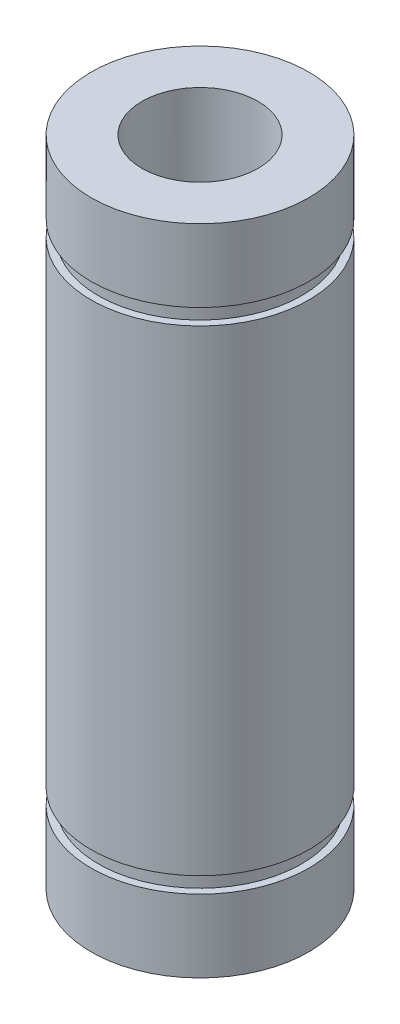
ISO-10303-21;
HEADER;
FILE_DESCRIPTION(('STEP AP214'),'2;1');
FILE_NAME('part.step','',(''),(''),'','','');
FILE_SCHEMA(('AUTOMOTIVE_DESIGN { 1 0 10303 214 1 1 1 1 }'));
ENDSEC;
DATA;
#1=APPLICATION_CONTEXT('core data for automotive mechanical design processes');
#2=APPLICATION_PROTOCOL_DEFINITION('international standard','automotive_design',2000,#1);
#3=PRODUCT_CONTEXT('',#1,'mechanical');
#4=PRODUCT('Part','Part','',(#3));
#5=PRODUCT_RELATED_PRODUCT_CATEGORY('part','',(#4));
#6=PRODUCT_DEFINITION_FORMATION('','',#4);
#7=PRODUCT_DEFINITION_CONTEXT('part definition',#1,'design');
#8=PRODUCT_DEFINITION('design','',#6,#7);
#9=PRODUCT_DEFINITION_SHAPE('','',#8);
#10=(LENGTH_UNIT() NAMED_UNIT(*) SI_UNIT(.MILLI.,.METRE.));
#11=(NAMED_UNIT(*) PLANE_ANGLE_UNIT() SI_UNIT($,.RADIAN.));
#12=(NAMED_UNIT(*) SI_UNIT($,.STERADIAN.) SOLID_ANGLE_UNIT());
#13=UNCERTAINTY_MEASURE_WITH_UNIT(LENGTH_MEASURE(1.E-05),#10,'distance_accuracy_value','');
#14=(GEOMETRIC_REPRESENTATION_CONTEXT(3) GLOBAL_UNCERTAINTY_ASSIGNED_CONTEXT((#13)) GLOBAL_UNIT_ASSIGNED_CONTEXT((#10,
#11,#12)) REPRESENTATION_CONTEXT('',''));
#15=CARTESIAN_POINT('',(0.,0.,0.));
#16=DIRECTION('',(0.,0.,1.));
#17=DIRECTION('',(1.,0.,0.));
#18=AXIS2_PLACEMENT_3D('',#15,#16,#17);
#19=CARTESIAN_POINT('',(0.,-33.9,0.));
#20=DIRECTION('',(0.,-1.,0.));
#21=DIRECTION('',(0.,0.,-1.));
#22=AXIS2_PLACEMENT_3D('',#19,#20,#21);
#23=PLANE('',#22);
#24=CARTESIAN_POINT('',(0.,-33.9,0.));
#25=DIRECTION('',(0.,-1.,0.));
#26=DIRECTION('',(0.,0.,-1.));
#27=AXIS2_PLACEMENT_3D('',#24,#25,#26);
#28=CIRCLE('',#27,7.5);
#29=CARTESIAN_POINT('',(0.,-33.9,-7.5));
#30=VERTEX_POINT('',#29);
#31=EDGE_CURVE('E55',#30,#30,#28,.T.);
#32=ORIENTED_EDGE('',*,*,#31,.T.);
#33=EDGE_LOOP('',(#32));
#34=FACE_BOUND('',#33,.T.);
#35=CARTESIAN_POINT('',(0.,-33.9,0.));
#36=DIRECTION('',(0.,-1.,0.));
#37=DIRECTION('',(0.,0.,-1.));
#38=AXIS2_PLACEMENT_3D('',#35,#36,#37);
#39=CIRCLE('',#38,7.);
#40=CARTESIAN_POINT('',(0.,-33.9,-7.));
#41=VERTEX_POINT('',#40);
#42=EDGE_CURVE('E62',#41,#41,#39,.T.);
#43=ORIENTED_EDGE('',*,*,#42,.F.);
#44=EDGE_LOOP('',(#43));
#45=FACE_BOUND('',#44,.T.);
#46=ADVANCED_FACE('F32',(#34,#45),#23,.T.);
#47=CARTESIAN_POINT('',(0.,0.,0.));
#48=DIRECTION('',(0.,1.,0.));
#49=DIRECTION('',(0.,0.,1.));
#50=AXIS2_PLACEMENT_3D('',#47,#48,#49);
#51=PLANE('',#50);
#52=CARTESIAN_POINT('',(0.,0.,0.));
#53=DIRECTION('',(0.,1.,0.));
#54=DIRECTION('',(0.,0.,1.));
#55=AXIS2_PLACEMENT_3D('',#52,#53,#54);
#56=CIRCLE('',#55,7.5);
#57=CARTESIAN_POINT('',(0.,0.,7.5));
#58=VERTEX_POINT('',#57);
#59=EDGE_CURVE('E43',#58,#58,#56,.T.);
#60=ORIENTED_EDGE('',*,*,#59,.F.);
#61=EDGE_LOOP('',(#60));
#62=FACE_BOUND('',#61,.T.);
#63=CARTESIAN_POINT('',(0.,0.,0.));
#64=DIRECTION('',(0.,1.,0.));
#65=DIRECTION('',(0.,0.,1.));
#66=AXIS2_PLACEMENT_3D('',#63,#64,#65);
#67=CIRCLE('',#66,7.);
#68=CARTESIAN_POINT('',(0.,0.,7.));
#69=VERTEX_POINT('',#68);
#70=EDGE_CURVE('E10',#69,#69,#67,.F.);
#71=ORIENTED_EDGE('',*,*,#70,.F.);
#72=EDGE_LOOP('',(#71));
#73=FACE_BOUND('',#72,.T.);
#74=ADVANCED_FACE('F96',(#62,#73),#51,.F.);
#75=CARTESIAN_POINT('',(0.,5.,0.));
#76=DIRECTION('',(0.,1.,0.));
#77=DIRECTION('',(0.,0.,1.));
#78=AXIS2_PLACEMENT_3D('',#75,#76,#77);
#79=PLANE('',#78);
#80=CARTESIAN_POINT('',(0.,5.,0.));
#81=DIRECTION('',(0.,1.,0.));
#82=DIRECTION('',(0.,0.,1.));
#83=AXIS2_PLACEMENT_3D('',#80,#81,#82);
#84=CIRCLE('',#83,7.5);
#85=CARTESIAN_POINT('',(0.,5.,7.5));
#86=VERTEX_POINT('',#85);
#87=EDGE_CURVE('E39',#86,#86,#84,.T.);
#88=ORIENTED_EDGE('',*,*,#87,.T.);
#89=EDGE_LOOP('',(#88));
#90=FACE_BOUND('',#89,.T.);
#91=CARTESIAN_POINT('',(0.,5.,0.));
#92=DIRECTION('',(0.,1.,0.));
#93=DIRECTION('',(0.,0.,1.));
#94=AXIS2_PLACEMENT_3D('',#91,#92,#93);
#95=CIRCLE('',#94,4.);
#96=CARTESIAN_POINT('',(0.,5.,4.));
#97=VERTEX_POINT('',#96);
#98=EDGE_CURVE('E48',#97,#97,#95,.T.);
#99=ORIENTED_EDGE('',*,*,#98,.F.);
#100=EDGE_LOOP('',(#99));
#101=FACE_BOUND('',#100,.T.);
#102=ADVANCED_FACE('F102',(#90,#101),#79,.T.);
#103=CARTESIAN_POINT('',(0.,5.,0.));
#104=DIRECTION('',(0.,-1.,0.));
#105=DIRECTION('',(0.,0.,-1.));
#106=AXIS2_PLACEMENT_3D('',#103,#104,#105);
#107=CYLINDRICAL_SURFACE('',#106,7.5);
#108=ORIENTED_EDGE('',*,*,#87,.F.);
#109=EDGE_LOOP('',(#108));
#110=FACE_BOUND('',#109,.T.);
#111=ORIENTED_EDGE('',*,*,#59,.T.);
#112=EDGE_LOOP('',(#111));
#113=FACE_BOUND('',#112,.T.);
#114=ADVANCED_FACE('F34',(#110,#113),#107,.T.);
#115=CARTESIAN_POINT('',(0.,5.,0.));
#116=DIRECTION('',(0.,-1.,0.));
#117=DIRECTION('',(0.,0.,-1.));
#118=AXIS2_PLACEMENT_3D('',#115,#116,#117);
#119=CYLINDRICAL_SURFACE('',#118,4.);
#120=ORIENTED_EDGE('',*,*,#98,.T.);
#121=EDGE_LOOP('',(#120));
#122=FACE_BOUND('',#121,.T.);
#123=CARTESIAN_POINT('',(0.,-40.,0.));
#124=DIRECTION('',(0.,-1.,0.));
#125=DIRECTION('',(0.,0.,-1.));
#126=AXIS2_PLACEMENT_3D('',#123,#124,#125);
#127=CIRCLE('',#126,4.);
#128=CARTESIAN_POINT('',(0.,-40.,-4.));
#129=VERTEX_POINT('',#128);
#130=EDGE_CURVE('E71',#129,#129,#127,.T.);
#131=ORIENTED_EDGE('',*,*,#130,.T.);
#132=EDGE_LOOP('',(#131));
#133=FACE_BOUND('',#132,.T.);
#134=ADVANCED_FACE('F77',(#122,#133),#119,.F.);
#135=CARTESIAN_POINT('',(0.,-1.1,0.));
#136=DIRECTION('',(0.,1.,0.));
#137=DIRECTION('',(0.,0.,1.));
#138=AXIS2_PLACEMENT_3D('',#135,#136,#137);
#139=CYLINDRICAL_SURFACE('',#138,7.);
#140=CARTESIAN_POINT('',(0.,-1.1,0.));
#141=DIRECTION('',(0.,-1.,0.));
#142=DIRECTION('',(0.,0.,-1.));
#143=AXIS2_PLACEMENT_3D('',#140,#141,#142);
#144=CIRCLE('',#143,7.);
#145=CARTESIAN_POINT('',(0.,-1.1,-7.));
#146=VERTEX_POINT('',#145);
#147=EDGE_CURVE('E52',#146,#146,#144,.T.);
#148=ORIENTED_EDGE('',*,*,#147,.F.);
#149=EDGE_LOOP('',(#148));
#150=FACE_BOUND('',#149,.T.);
#151=ORIENTED_EDGE('',*,*,#70,.T.);
#152=EDGE_LOOP('',(#151));
#153=FACE_BOUND('',#152,.T.);
#154=ADVANCED_FACE('F110',(#150,#153),#139,.T.);
#155=CARTESIAN_POINT('',(0.,-1.1,0.));
#156=DIRECTION('',(0.,-1.,0.));
#157=DIRECTION('',(0.,0.,-1.));
#158=AXIS2_PLACEMENT_3D('',#155,#156,#157);
#159=PLANE('',#158);
#160=ORIENTED_EDGE('',*,*,#147,.T.);
#161=EDGE_LOOP('',(#160));
#162=FACE_BOUND('',#161,.T.);
#163=CARTESIAN_POINT('',(0.,-1.1,0.));
#164=DIRECTION('',(0.,-1.,0.));
#165=DIRECTION('',(0.,0.,-1.));
#166=AXIS2_PLACEMENT_3D('',#163,#164,#165);
#167=CIRCLE('',#166,7.5);
#168=CARTESIAN_POINT('',(0.,-1.1,-7.5));
#169=VERTEX_POINT('',#168);
#170=EDGE_CURVE('E56',#169,#169,#167,.T.);
#171=ORIENTED_EDGE('',*,*,#170,.F.);
#172=EDGE_LOOP('',(#171));
#173=FACE_BOUND('',#172,.T.);
#174=ADVANCED_FACE('F107',(#162,#173),#159,.F.);
#175=CARTESIAN_POINT('',(0.,-33.9,0.));
#176=DIRECTION('',(0.,1.,0.));
#177=DIRECTION('',(0.,0.,1.));
#178=AXIS2_PLACEMENT_3D('',#175,#176,#177);
#179=CYLINDRICAL_SURFACE('',#178,7.5);
#180=ORIENTED_EDGE('',*,*,#31,.F.);
#181=EDGE_LOOP('',(#180));
#182=FACE_BOUND('',#181,.T.);
#183=ORIENTED_EDGE('',*,*,#170,.T.);
#184=EDGE_LOOP('',(#183));
#185=FACE_BOUND('',#184,.T.);
#186=ADVANCED_FACE('F92',(#182,#185),#179,.T.);
#187=CARTESIAN_POINT('',(0.,-35.,0.));
#188=DIRECTION('',(0.,1.,0.));
#189=DIRECTION('',(0.,0.,1.));
#190=AXIS2_PLACEMENT_3D('',#187,#188,#189);
#191=CYLINDRICAL_SURFACE('',#190,7.);
#192=CARTESIAN_POINT('',(0.,-35.,0.));
#193=DIRECTION('',(0.,-1.,0.));
#194=DIRECTION('',(0.,0.,-1.));
#195=AXIS2_PLACEMENT_3D('',#192,#193,#194);
#196=CIRCLE('',#195,7.);
#197=CARTESIAN_POINT('',(0.,-35.,-7.));
#198=VERTEX_POINT('',#197);
#199=EDGE_CURVE('E59',#198,#198,#196,.T.);
#200=ORIENTED_EDGE('',*,*,#199,.F.);
#201=EDGE_LOOP('',(#200));
#202=FACE_BOUND('',#201,.T.);
#203=ORIENTED_EDGE('',*,*,#42,.T.);
#204=EDGE_LOOP('',(#203));
#205=FACE_BOUND('',#204,.T.);
#206=ADVANCED_FACE('F82',(#202,#205),#191,.T.);
#207=CARTESIAN_POINT('',(0.,-40.,0.));
#208=DIRECTION('',(0.,-1.,0.));
#209=DIRECTION('',(0.,0.,-1.));
#210=AXIS2_PLACEMENT_3D('',#207,#208,#209);
#211=PLANE('',#210);
#212=CARTESIAN_POINT('',(0.,-40.,0.));
#213=DIRECTION('',(0.,-1.,0.));
#214=DIRECTION('',(0.,0.,-1.));
#215=AXIS2_PLACEMENT_3D('',#212,#213,#214);
#216=CIRCLE('',#215,7.5);
#217=CARTESIAN_POINT('',(0.,-40.,-7.5));
#218=VERTEX_POINT('',#217);
#219=EDGE_CURVE('E65',#218,#218,#216,.T.);
#220=ORIENTED_EDGE('',*,*,#219,.T.);
#221=EDGE_LOOP('',(#220));
#222=FACE_BOUND('',#221,.T.);
#223=ORIENTED_EDGE('',*,*,#130,.F.);
#224=EDGE_LOOP('',(#223));
#225=FACE_BOUND('',#224,.T.);
#226=ADVANCED_FACE('F79',(#222,#225),#211,.T.);
#227=CARTESIAN_POINT('',(0.,-35.,0.));
#228=DIRECTION('',(0.,-1.,0.));
#229=DIRECTION('',(0.,0.,-1.));
#230=AXIS2_PLACEMENT_3D('',#227,#228,#229);
#231=PLANE('',#230);
#232=ORIENTED_EDGE('',*,*,#199,.T.);
#233=EDGE_LOOP('',(#232));
#234=FACE_BOUND('',#233,.T.);
#235=CARTESIAN_POINT('',(0.,-35.,0.));
#236=DIRECTION('',(0.,-1.,0.));
#237=DIRECTION('',(0.,0.,-1.));
#238=AXIS2_PLACEMENT_3D('',#235,#236,#237);
#239=CIRCLE('',#238,7.5);
#240=CARTESIAN_POINT('',(0.,-35.,-7.5));
#241=VERTEX_POINT('',#240);
#242=EDGE_CURVE('E68',#241,#241,#239,.T.);
#243=ORIENTED_EDGE('',*,*,#242,.F.);
#244=EDGE_LOOP('',(#243));
#245=FACE_BOUND('',#244,.T.);
#246=ADVANCED_FACE('F81',(#234,#245),#231,.F.);
#247=CARTESIAN_POINT('',(0.,-40.,0.));
#248=DIRECTION('',(0.,1.,0.));
#249=DIRECTION('',(0.,0.,1.));
#250=AXIS2_PLACEMENT_3D('',#247,#248,#249);
#251=CYLINDRICAL_SURFACE('',#250,7.5);
#252=ORIENTED_EDGE('',*,*,#219,.F.);
#253=EDGE_LOOP('',(#252));
#254=FACE_BOUND('',#253,.T.);
#255=ORIENTED_EDGE('',*,*,#242,.T.);
#256=EDGE_LOOP('',(#255));
#257=FACE_BOUND('',#256,.T.);
#258=ADVANCED_FACE('F89',(#254,#257),#251,.T.);
#259=CLOSED_SHELL('',(#46,#74,#102,#114,#134,#154,#174,#186,#206,#226,#246,#258));
#260=MANIFOLD_SOLID_BREP('B2',#259);
#261=ADVANCED_BREP_SHAPE_REPRESENTATION('',(#18,#260),#14);
#262=SHAPE_DEFINITION_REPRESENTATION(#9,#261);
ENDSEC;
END-ISO-10303-21;
